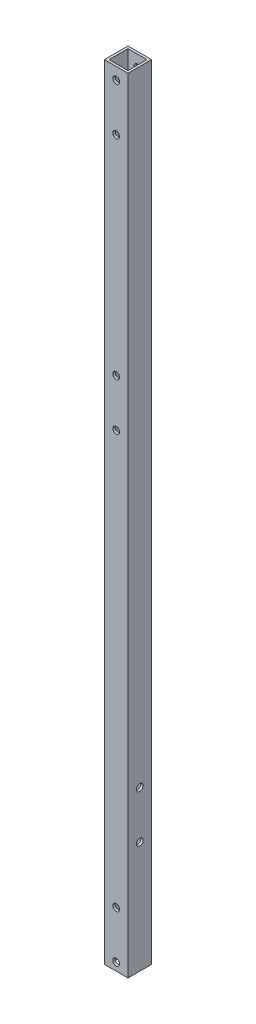
ISO-10303-21;
HEADER;
FILE_DESCRIPTION(('STEP AP214'),'2;1');
FILE_NAME('part.step','',(''),(''),'','','');
FILE_SCHEMA(('AUTOMOTIVE_DESIGN { 1 0 10303 214 1 1 1 1 }'));
ENDSEC;
DATA;
#1=APPLICATION_CONTEXT('core data for automotive mechanical design processes');
#2=APPLICATION_PROTOCOL_DEFINITION('international standard','automotive_design',2000,#1);
#3=PRODUCT_CONTEXT('',#1,'mechanical');
#4=PRODUCT('Part','Part','',(#3));
#5=PRODUCT_RELATED_PRODUCT_CATEGORY('part','',(#4));
#6=PRODUCT_DEFINITION_FORMATION('','',#4);
#7=PRODUCT_DEFINITION_CONTEXT('part definition',#1,'design');
#8=PRODUCT_DEFINITION('design','',#6,#7);
#9=PRODUCT_DEFINITION_SHAPE('','',#8);
#10=(LENGTH_UNIT() NAMED_UNIT(*) SI_UNIT(.MILLI.,.METRE.));
#11=(NAMED_UNIT(*) PLANE_ANGLE_UNIT() SI_UNIT($,.RADIAN.));
#12=(NAMED_UNIT(*) SI_UNIT($,.STERADIAN.) SOLID_ANGLE_UNIT());
#13=UNCERTAINTY_MEASURE_WITH_UNIT(LENGTH_MEASURE(1.E-05),#10,'distance_accuracy_value','');
#14=(GEOMETRIC_REPRESENTATION_CONTEXT(3) GLOBAL_UNCERTAINTY_ASSIGNED_CONTEXT((#13)) GLOBAL_UNIT_ASSIGNED_CONTEXT((#10,
#11,#12)) REPRESENTATION_CONTEXT('',''));
#15=CARTESIAN_POINT('',(0.,0.,0.));
#16=DIRECTION('',(0.,0.,1.));
#17=DIRECTION('',(1.,0.,0.));
#18=AXIS2_PLACEMENT_3D('',#15,#16,#17);
#19=CARTESIAN_POINT('',(0.,497.5,0.));
#20=DIRECTION('',(0.,1.,0.));
#21=DIRECTION('',(0.,0.,1.));
#22=AXIS2_PLACEMENT_3D('',#19,#20,#21);
#23=PLANE('',#22);
#24=DIRECTION('',(0.,0.,-1.));
#25=VECTOR('',#24,1.);
#26=CARTESIAN_POINT('',(7.49999999999999,497.5,-7.5));
#27=LINE('',#26,#25);
#28=CARTESIAN_POINT('',(7.5,497.5,7.5));
#29=VERTEX_POINT('',#28);
#30=CARTESIAN_POINT('',(7.49999999999999,497.5,-7.5));
#31=VERTEX_POINT('',#30);
#32=EDGE_CURVE('E164',#29,#31,#27,.T.);
#33=ORIENTED_EDGE('',*,*,#32,.T.);
#34=DIRECTION('',(-1.,0.,0.));
#35=VECTOR('',#34,1.);
#36=CARTESIAN_POINT('',(-7.50000000000001,497.5,-7.5));
#37=LINE('',#36,#35);
#38=CARTESIAN_POINT('',(-7.50000000000001,497.5,-7.5));
#39=VERTEX_POINT('',#38);
#40=EDGE_CURVE('E167',#31,#39,#37,.T.);
#41=ORIENTED_EDGE('',*,*,#40,.T.);
#42=DIRECTION('',(0.,0.,1.));
#43=VECTOR('',#42,1.);
#44=CARTESIAN_POINT('',(-7.50000000000001,497.5,-7.5));
#45=LINE('',#44,#43);
#46=CARTESIAN_POINT('',(-7.5,497.5,7.5));
#47=VERTEX_POINT('',#46);
#48=EDGE_CURVE('E170',#39,#47,#45,.T.);
#49=ORIENTED_EDGE('',*,*,#48,.T.);
#50=DIRECTION('',(1.,0.,0.));
#51=VECTOR('',#50,1.);
#52=CARTESIAN_POINT('',(-7.5,497.5,7.5));
#53=LINE('',#52,#51);
#54=EDGE_CURVE('E172',#47,#29,#53,.T.);
#55=ORIENTED_EDGE('',*,*,#54,.T.);
#56=EDGE_LOOP('',(#33,#41,#49,#55));
#57=FACE_BOUND('',#56,.T.);
#58=DIRECTION('',(-1.,0.,0.));
#59=VECTOR('',#58,1.);
#60=CARTESIAN_POINT('',(-7.50000000000001,497.5,-6.));
#61=LINE('',#60,#59);
#62=CARTESIAN_POINT('',(5.99999999999999,497.5,-6.));
#63=VERTEX_POINT('',#62);
#64=CARTESIAN_POINT('',(-6.00000000000001,497.5,-6.));
#65=VERTEX_POINT('',#64);
#66=EDGE_CURVE('E134',#63,#65,#61,.T.);
#67=ORIENTED_EDGE('',*,*,#66,.F.);
#68=DIRECTION('',(0.,0.,-1.));
#69=VECTOR('',#68,1.);
#70=CARTESIAN_POINT('',(5.99999999999999,497.5,-7.5));
#71=LINE('',#70,#69);
#72=CARTESIAN_POINT('',(6.,497.5,5.99999999999999));
#73=VERTEX_POINT('',#72);
#74=EDGE_CURVE('E126',#73,#63,#71,.T.);
#75=ORIENTED_EDGE('',*,*,#74,.F.);
#76=DIRECTION('',(1.,0.,0.));
#77=VECTOR('',#76,1.);
#78=CARTESIAN_POINT('',(-7.5,497.5,5.99999999999999));
#79=LINE('',#78,#77);
#80=CARTESIAN_POINT('',(-6.,497.5,5.99999999999999));
#81=VERTEX_POINT('',#80);
#82=EDGE_CURVE('E148',#81,#73,#79,.T.);
#83=ORIENTED_EDGE('',*,*,#82,.F.);
#84=DIRECTION('',(0.,0.,1.));
#85=VECTOR('',#84,1.);
#86=CARTESIAN_POINT('',(-6.00000000000001,497.5,-7.5));
#87=LINE('',#86,#85);
#88=EDGE_CURVE('E146',#65,#81,#87,.T.);
#89=ORIENTED_EDGE('',*,*,#88,.F.);
#90=EDGE_LOOP('',(#67,#75,#83,#89));
#91=FACE_BOUND('',#90,.T.);
#92=ADVANCED_FACE('F59',(#57,#91),#23,.T.);
#93=CARTESIAN_POINT('',(0.,0.,0.));
#94=DIRECTION('',(0.,1.,0.));
#95=DIRECTION('',(0.,0.,1.));
#96=AXIS2_PLACEMENT_3D('',#93,#94,#95);
#97=PLANE('',#96);
#98=DIRECTION('',(0.,0.,-1.));
#99=VECTOR('',#98,1.);
#100=CARTESIAN_POINT('',(7.49999999999999,0.,-7.5));
#101=LINE('',#100,#99);
#102=CARTESIAN_POINT('',(7.5,0.,7.5));
#103=VERTEX_POINT('',#102);
#104=CARTESIAN_POINT('',(7.49999999999999,0.,-7.5));
#105=VERTEX_POINT('',#104);
#106=EDGE_CURVE('E142',#103,#105,#101,.T.);
#107=ORIENTED_EDGE('',*,*,#106,.F.);
#108=DIRECTION('',(1.,0.,0.));
#109=VECTOR('',#108,1.);
#110=CARTESIAN_POINT('',(-7.5,0.,7.5));
#111=LINE('',#110,#109);
#112=CARTESIAN_POINT('',(-7.5,0.,7.5));
#113=VERTEX_POINT('',#112);
#114=EDGE_CURVE('E168',#113,#103,#111,.T.);
#115=ORIENTED_EDGE('',*,*,#114,.F.);
#116=DIRECTION('',(0.,0.,1.));
#117=VECTOR('',#116,1.);
#118=CARTESIAN_POINT('',(-7.50000000000001,0.,-7.5));
#119=LINE('',#118,#117);
#120=CARTESIAN_POINT('',(-7.50000000000001,0.,-7.5));
#121=VERTEX_POINT('',#120);
#122=EDGE_CURVE('E179',#121,#113,#119,.T.);
#123=ORIENTED_EDGE('',*,*,#122,.F.);
#124=DIRECTION('',(-1.,0.,0.));
#125=VECTOR('',#124,1.);
#126=CARTESIAN_POINT('',(-7.50000000000001,0.,-7.5));
#127=LINE('',#126,#125);
#128=EDGE_CURVE('E177',#105,#121,#127,.T.);
#129=ORIENTED_EDGE('',*,*,#128,.F.);
#130=EDGE_LOOP('',(#107,#115,#123,#129));
#131=FACE_BOUND('',#130,.T.);
#132=DIRECTION('',(0.,0.,-1.));
#133=VECTOR('',#132,1.);
#134=CARTESIAN_POINT('',(5.99999999999999,0.,-7.5));
#135=LINE('',#134,#133);
#136=CARTESIAN_POINT('',(6.,0.,5.99999999999999));
#137=VERTEX_POINT('',#136);
#138=CARTESIAN_POINT('',(5.99999999999999,0.,-6.));
#139=VERTEX_POINT('',#138);
#140=EDGE_CURVE('E84',#137,#139,#135,.T.);
#141=ORIENTED_EDGE('',*,*,#140,.T.);
#142=DIRECTION('',(-1.,0.,0.));
#143=VECTOR('',#142,1.);
#144=CARTESIAN_POINT('',(-7.50000000000001,0.,-6.));
#145=LINE('',#144,#143);
#146=CARTESIAN_POINT('',(-6.00000000000001,0.,-6.));
#147=VERTEX_POINT('',#146);
#148=EDGE_CURVE('E141',#139,#147,#145,.T.);
#149=ORIENTED_EDGE('',*,*,#148,.T.);
#150=DIRECTION('',(0.,0.,1.));
#151=VECTOR('',#150,1.);
#152=CARTESIAN_POINT('',(-6.00000000000001,0.,-7.5));
#153=LINE('',#152,#151);
#154=CARTESIAN_POINT('',(-6.,0.,5.99999999999999));
#155=VERTEX_POINT('',#154);
#156=EDGE_CURVE('E156',#147,#155,#153,.T.);
#157=ORIENTED_EDGE('',*,*,#156,.T.);
#158=DIRECTION('',(1.,0.,0.));
#159=VECTOR('',#158,1.);
#160=CARTESIAN_POINT('',(-7.5,0.,5.99999999999999));
#161=LINE('',#160,#159);
#162=EDGE_CURVE('E135',#155,#137,#161,.T.);
#163=ORIENTED_EDGE('',*,*,#162,.T.);
#164=EDGE_LOOP('',(#141,#149,#157,#163));
#165=FACE_BOUND('',#164,.T.);
#166=ADVANCED_FACE('F265',(#131,#165),#97,.F.);
#167=CARTESIAN_POINT('',(7.49999999999999,497.5,-7.5));
#168=DIRECTION('',(-1.,0.,0.));
#169=DIRECTION('',(0.,0.,1.));
#170=AXIS2_PLACEMENT_3D('',#167,#168,#169);
#171=PLANE('',#170);
#172=CARTESIAN_POINT('',(7.5,71.,0.));
#173=DIRECTION('',(1.,0.,0.));
#174=DIRECTION('',(0.,0.,-1.));
#175=AXIS2_PLACEMENT_3D('',#172,#173,#174);
#176=CIRCLE('',#175,2.15);
#177=CARTESIAN_POINT('',(7.5,71.,-2.15));
#178=VERTEX_POINT('',#177);
#179=EDGE_CURVE('E233',#178,#178,#176,.T.);
#180=ORIENTED_EDGE('',*,*,#179,.F.);
#181=EDGE_LOOP('',(#180));
#182=FACE_BOUND('',#181,.T.);
#183=CARTESIAN_POINT('',(7.5,101.,0.));
#184=DIRECTION('',(1.,0.,0.));
#185=DIRECTION('',(0.,0.,-1.));
#186=AXIS2_PLACEMENT_3D('',#183,#184,#185);
#187=CIRCLE('',#186,2.15);
#188=CARTESIAN_POINT('',(7.5,101.,-2.15));
#189=VERTEX_POINT('',#188);
#190=EDGE_CURVE('E230',#189,#189,#187,.T.);
#191=ORIENTED_EDGE('',*,*,#190,.F.);
#192=EDGE_LOOP('',(#191));
#193=FACE_BOUND('',#192,.T.);
#194=ORIENTED_EDGE('',*,*,#106,.T.);
#195=DIRECTION('',(0.,-1.,0.));
#196=VECTOR('',#195,1.);
#197=CARTESIAN_POINT('',(7.49999999999999,497.5,-7.5));
#198=LINE('',#197,#196);
#199=EDGE_CURVE('E12',#31,#105,#198,.T.);
#200=ORIENTED_EDGE('',*,*,#199,.F.);
#201=ORIENTED_EDGE('',*,*,#32,.F.);
#202=DIRECTION('',(0.,-1.,0.));
#203=VECTOR('',#202,1.);
#204=CARTESIAN_POINT('',(7.5,497.5,7.5));
#205=LINE('',#204,#203);
#206=EDGE_CURVE('E174',#29,#103,#205,.T.);
#207=ORIENTED_EDGE('',*,*,#206,.T.);
#208=EDGE_LOOP('',(#194,#200,#201,#207));
#209=FACE_BOUND('',#208,.T.);
#210=ADVANCED_FACE('F61',(#182,#193,#209),#171,.F.);
#211=CARTESIAN_POINT('',(-7.50000000000001,497.5,-7.5));
#212=DIRECTION('',(0.,0.,1.));
#213=DIRECTION('',(1.,0.,0.));
#214=AXIS2_PLACEMENT_3D('',#211,#212,#213);
#215=PLANE('',#214);
#216=CARTESIAN_POINT('',(0.,5.,-7.5));
#217=DIRECTION('',(0.,0.,1.));
#218=DIRECTION('',(1.,0.,0.));
#219=AXIS2_PLACEMENT_3D('',#216,#217,#218);
#220=CIRCLE('',#219,2.15);
#221=CARTESIAN_POINT('',(2.15,5.,-7.5));
#222=VERTEX_POINT('',#221);
#223=EDGE_CURVE('E373',#222,#222,#220,.T.);
#224=ORIENTED_EDGE('',*,*,#223,.T.);
#225=EDGE_LOOP('',(#224));
#226=FACE_BOUND('',#225,.T.);
#227=CARTESIAN_POINT('',(0.,297.5,-7.5));
#228=DIRECTION('',(0.,0.,1.));
#229=DIRECTION('',(1.,0.,0.));
#230=AXIS2_PLACEMENT_3D('',#227,#228,#229);
#231=CIRCLE('',#230,2.15000000000001);
#232=CARTESIAN_POINT('',(2.15000000000004,297.5,-7.5));
#233=VERTEX_POINT('',#232);
#234=EDGE_CURVE('E380',#233,#233,#231,.T.);
#235=ORIENTED_EDGE('',*,*,#234,.T.);
#236=EDGE_LOOP('',(#235));
#237=FACE_BOUND('',#236,.T.);
#238=CARTESIAN_POINT('',(0.,327.5,-7.5));
#239=DIRECTION('',(0.,0.,1.));
#240=DIRECTION('',(1.,0.,0.));
#241=AXIS2_PLACEMENT_3D('',#238,#239,#240);
#242=CIRCLE('',#241,2.15000000000001);
#243=CARTESIAN_POINT('',(2.15000000000004,327.5,-7.5));
#244=VERTEX_POINT('',#243);
#245=EDGE_CURVE('E386',#244,#244,#242,.T.);
#246=ORIENTED_EDGE('',*,*,#245,.T.);
#247=EDGE_LOOP('',(#246));
#248=FACE_BOUND('',#247,.T.);
#249=CARTESIAN_POINT('',(0.,490.,-7.5));
#250=DIRECTION('',(0.,0.,1.));
#251=DIRECTION('',(1.,0.,0.));
#252=AXIS2_PLACEMENT_3D('',#249,#250,#251);
#253=CIRCLE('',#252,2.15000000000001);
#254=CARTESIAN_POINT('',(2.15000000000002,490.,-7.5));
#255=VERTEX_POINT('',#254);
#256=EDGE_CURVE('E368',#255,#255,#253,.T.);
#257=ORIENTED_EDGE('',*,*,#256,.T.);
#258=EDGE_LOOP('',(#257));
#259=FACE_BOUND('',#258,.T.);
#260=CARTESIAN_POINT('',(0.,460.,-7.5));
#261=DIRECTION('',(0.,0.,1.));
#262=DIRECTION('',(1.,0.,0.));
#263=AXIS2_PLACEMENT_3D('',#260,#261,#262);
#264=CIRCLE('',#263,2.15000000000001);
#265=CARTESIAN_POINT('',(2.15000000000003,460.,-7.5));
#266=VERTEX_POINT('',#265);
#267=EDGE_CURVE('E362',#266,#266,#264,.T.);
#268=ORIENTED_EDGE('',*,*,#267,.T.);
#269=EDGE_LOOP('',(#268));
#270=FACE_BOUND('',#269,.T.);
#271=CARTESIAN_POINT('',(0.,35.,-7.5));
#272=DIRECTION('',(0.,0.,1.));
#273=DIRECTION('',(1.,0.,0.));
#274=AXIS2_PLACEMENT_3D('',#271,#272,#273);
#275=CIRCLE('',#274,2.15);
#276=CARTESIAN_POINT('',(2.15,35.,-7.5));
#277=VERTEX_POINT('',#276);
#278=EDGE_CURVE('E201',#277,#277,#275,.T.);
#279=ORIENTED_EDGE('',*,*,#278,.T.);
#280=EDGE_LOOP('',(#279));
#281=FACE_BOUND('',#280,.T.);
#282=ORIENTED_EDGE('',*,*,#128,.T.);
#283=DIRECTION('',(0.,-1.,0.));
#284=VECTOR('',#283,1.);
#285=CARTESIAN_POINT('',(-7.50000000000001,497.5,-7.5));
#286=LINE('',#285,#284);
#287=EDGE_CURVE('E68',#39,#121,#286,.T.);
#288=ORIENTED_EDGE('',*,*,#287,.F.);
#289=ORIENTED_EDGE('',*,*,#40,.F.);
#290=ORIENTED_EDGE('',*,*,#199,.T.);
#291=EDGE_LOOP('',(#282,#288,#289,#290));
#292=FACE_BOUND('',#291,.T.);
#293=ADVANCED_FACE('F264',(#226,#237,#248,#259,#270,#281,#292),#215,.F.);
#294=CARTESIAN_POINT('',(-7.50000000000001,497.5,-7.5));
#295=DIRECTION('',(1.,0.,0.));
#296=DIRECTION('',(0.,0.,-1.));
#297=AXIS2_PLACEMENT_3D('',#294,#295,#296);
#298=PLANE('',#297);
#299=CARTESIAN_POINT('',(-7.50000000000001,71.,0.));
#300=DIRECTION('',(1.,0.,0.));
#301=DIRECTION('',(0.,0.,-1.));
#302=AXIS2_PLACEMENT_3D('',#299,#300,#301);
#303=CIRCLE('',#302,2.15);
#304=CARTESIAN_POINT('',(-7.50000000000001,71.,-2.15));
#305=VERTEX_POINT('',#304);
#306=EDGE_CURVE('E193',#305,#305,#303,.T.);
#307=ORIENTED_EDGE('',*,*,#306,.T.);
#308=EDGE_LOOP('',(#307));
#309=FACE_BOUND('',#308,.T.);
#310=CARTESIAN_POINT('',(-7.50000000000001,101.,0.));
#311=DIRECTION('',(1.,0.,0.));
#312=DIRECTION('',(0.,0.,-1.));
#313=AXIS2_PLACEMENT_3D('',#310,#311,#312);
#314=CIRCLE('',#313,2.15);
#315=CARTESIAN_POINT('',(-7.50000000000001,101.,-2.15));
#316=VERTEX_POINT('',#315);
#317=EDGE_CURVE('E236',#316,#316,#314,.T.);
#318=ORIENTED_EDGE('',*,*,#317,.T.);
#319=EDGE_LOOP('',(#318));
#320=FACE_BOUND('',#319,.T.);
#321=ORIENTED_EDGE('',*,*,#122,.T.);
#322=DIRECTION('',(0.,-1.,0.));
#323=VECTOR('',#322,1.);
#324=CARTESIAN_POINT('',(-7.5,497.5,7.5));
#325=LINE('',#324,#323);
#326=EDGE_CURVE('E184',#47,#113,#325,.T.);
#327=ORIENTED_EDGE('',*,*,#326,.F.);
#328=ORIENTED_EDGE('',*,*,#48,.F.);
#329=ORIENTED_EDGE('',*,*,#287,.T.);
#330=EDGE_LOOP('',(#321,#327,#328,#329));
#331=FACE_BOUND('',#330,.T.);
#332=ADVANCED_FACE('F283',(#309,#320,#331),#298,.F.);
#333=CARTESIAN_POINT('',(-7.5,497.5,7.5));
#334=DIRECTION('',(0.,0.,-1.));
#335=DIRECTION('',(-1.,0.,0.));
#336=AXIS2_PLACEMENT_3D('',#333,#334,#335);
#337=PLANE('',#336);
#338=CARTESIAN_POINT('',(0.,5.,7.5));
#339=DIRECTION('',(0.,0.,1.));
#340=DIRECTION('',(1.,0.,0.));
#341=AXIS2_PLACEMENT_3D('',#338,#339,#340);
#342=CIRCLE('',#341,2.15);
#343=CARTESIAN_POINT('',(2.15,5.,7.5));
#344=VERTEX_POINT('',#343);
#345=EDGE_CURVE('E377',#344,#344,#342,.T.);
#346=ORIENTED_EDGE('',*,*,#345,.F.);
#347=EDGE_LOOP('',(#346));
#348=FACE_BOUND('',#347,.T.);
#349=CARTESIAN_POINT('',(0.,297.5,7.5));
#350=DIRECTION('',(0.,0.,1.));
#351=DIRECTION('',(1.,0.,0.));
#352=AXIS2_PLACEMENT_3D('',#349,#350,#351);
#353=CIRCLE('',#352,2.15000000000001);
#354=CARTESIAN_POINT('',(2.15000000000004,297.5,7.5));
#355=VERTEX_POINT('',#354);
#356=EDGE_CURVE('E383',#355,#355,#353,.T.);
#357=ORIENTED_EDGE('',*,*,#356,.F.);
#358=EDGE_LOOP('',(#357));
#359=FACE_BOUND('',#358,.T.);
#360=CARTESIAN_POINT('',(0.,327.5,7.5));
#361=DIRECTION('',(0.,0.,1.));
#362=DIRECTION('',(1.,0.,0.));
#363=AXIS2_PLACEMENT_3D('',#360,#361,#362);
#364=CIRCLE('',#363,2.15000000000001);
#365=CARTESIAN_POINT('',(2.15000000000004,327.5,7.5));
#366=VERTEX_POINT('',#365);
#367=EDGE_CURVE('E389',#366,#366,#364,.T.);
#368=ORIENTED_EDGE('',*,*,#367,.F.);
#369=EDGE_LOOP('',(#368));
#370=FACE_BOUND('',#369,.T.);
#371=CARTESIAN_POINT('',(0.,490.,7.5));
#372=DIRECTION('',(0.,0.,1.));
#373=DIRECTION('',(1.,0.,0.));
#374=AXIS2_PLACEMENT_3D('',#371,#372,#373);
#375=CIRCLE('',#374,2.15000000000001);
#376=CARTESIAN_POINT('',(2.15000000000002,490.,7.5));
#377=VERTEX_POINT('',#376);
#378=EDGE_CURVE('E364',#377,#377,#375,.T.);
#379=ORIENTED_EDGE('',*,*,#378,.F.);
#380=EDGE_LOOP('',(#379));
#381=FACE_BOUND('',#380,.T.);
#382=CARTESIAN_POINT('',(0.,460.,7.5));
#383=DIRECTION('',(0.,0.,1.));
#384=DIRECTION('',(1.,0.,0.));
#385=AXIS2_PLACEMENT_3D('',#382,#383,#384);
#386=CIRCLE('',#385,2.15000000000001);
#387=CARTESIAN_POINT('',(2.15000000000003,460.,7.5));
#388=VERTEX_POINT('',#387);
#389=EDGE_CURVE('E365',#388,#388,#386,.T.);
#390=ORIENTED_EDGE('',*,*,#389,.F.);
#391=EDGE_LOOP('',(#390));
#392=FACE_BOUND('',#391,.T.);
#393=CARTESIAN_POINT('',(0.,35.,7.5));
#394=DIRECTION('',(0.,0.,1.));
#395=DIRECTION('',(1.,0.,0.));
#396=AXIS2_PLACEMENT_3D('',#393,#394,#395);
#397=CIRCLE('',#396,2.15);
#398=CARTESIAN_POINT('',(2.15,35.,7.5));
#399=VERTEX_POINT('',#398);
#400=EDGE_CURVE('E376',#399,#399,#397,.T.);
#401=ORIENTED_EDGE('',*,*,#400,.F.);
#402=EDGE_LOOP('',(#401));
#403=FACE_BOUND('',#402,.T.);
#404=ORIENTED_EDGE('',*,*,#114,.T.);
#405=ORIENTED_EDGE('',*,*,#206,.F.);
#406=ORIENTED_EDGE('',*,*,#54,.F.);
#407=ORIENTED_EDGE('',*,*,#326,.T.);
#408=EDGE_LOOP('',(#404,#405,#406,#407));
#409=FACE_BOUND('',#408,.T.);
#410=ADVANCED_FACE('F250',(#348,#359,#370,#381,#392,#403,#409),#337,.F.);
#411=CARTESIAN_POINT('',(5.99999999999999,497.5,-7.5));
#412=DIRECTION('',(-1.,0.,0.));
#413=DIRECTION('',(0.,0.,1.));
#414=AXIS2_PLACEMENT_3D('',#411,#412,#413);
#415=PLANE('',#414);
#416=CARTESIAN_POINT('',(6.,71.,0.));
#417=DIRECTION('',(-1.,0.,0.));
#418=DIRECTION('',(0.,0.,1.));
#419=AXIS2_PLACEMENT_3D('',#416,#417,#418);
#420=CIRCLE('',#419,2.15);
#421=CARTESIAN_POINT('',(6.,71.,2.15));
#422=VERTEX_POINT('',#421);
#423=EDGE_CURVE('E154',#422,#422,#420,.T.);
#424=ORIENTED_EDGE('',*,*,#423,.F.);
#425=EDGE_LOOP('',(#424));
#426=FACE_BOUND('',#425,.T.);
#427=CARTESIAN_POINT('',(6.,101.,0.));
#428=DIRECTION('',(-1.,0.,0.));
#429=DIRECTION('',(0.,0.,1.));
#430=AXIS2_PLACEMENT_3D('',#427,#428,#429);
#431=CIRCLE('',#430,2.15);
#432=CARTESIAN_POINT('',(6.,101.,2.15));
#433=VERTEX_POINT('',#432);
#434=EDGE_CURVE('E192',#433,#433,#431,.T.);
#435=ORIENTED_EDGE('',*,*,#434,.F.);
#436=EDGE_LOOP('',(#435));
#437=FACE_BOUND('',#436,.T.);
#438=ORIENTED_EDGE('',*,*,#140,.F.);
#439=DIRECTION('',(0.,-1.,0.));
#440=VECTOR('',#439,1.);
#441=CARTESIAN_POINT('',(6.,497.5,5.99999999999999));
#442=LINE('',#441,#440);
#443=EDGE_CURVE('E130',#73,#137,#442,.T.);
#444=ORIENTED_EDGE('',*,*,#443,.F.);
#445=ORIENTED_EDGE('',*,*,#74,.T.);
#446=DIRECTION('',(0.,-1.,0.));
#447=VECTOR('',#446,1.);
#448=CARTESIAN_POINT('',(5.99999999999999,497.5,-6.));
#449=LINE('',#448,#447);
#450=EDGE_CURVE('E129',#63,#139,#449,.T.);
#451=ORIENTED_EDGE('',*,*,#450,.T.);
#452=EDGE_LOOP('',(#438,#444,#445,#451));
#453=FACE_BOUND('',#452,.T.);
#454=ADVANCED_FACE('F128',(#426,#437,#453),#415,.T.);
#455=CARTESIAN_POINT('',(-7.50000000000001,497.5,-6.));
#456=DIRECTION('',(0.,0.,1.));
#457=DIRECTION('',(1.,0.,0.));
#458=AXIS2_PLACEMENT_3D('',#455,#456,#457);
#459=PLANE('',#458);
#460=CARTESIAN_POINT('',(0.,5.,-6.));
#461=DIRECTION('',(0.,0.,1.));
#462=DIRECTION('',(1.,0.,0.));
#463=AXIS2_PLACEMENT_3D('',#460,#461,#462);
#464=CIRCLE('',#463,2.15);
#465=CARTESIAN_POINT('',(2.15,5.,-6.));
#466=VERTEX_POINT('',#465);
#467=EDGE_CURVE('E227',#466,#466,#464,.T.);
#468=ORIENTED_EDGE('',*,*,#467,.F.);
#469=EDGE_LOOP('',(#468));
#470=FACE_BOUND('',#469,.T.);
#471=CARTESIAN_POINT('',(0.,297.5,-6.));
#472=DIRECTION('',(0.,0.,1.));
#473=DIRECTION('',(1.,0.,0.));
#474=AXIS2_PLACEMENT_3D('',#471,#472,#473);
#475=CIRCLE('',#474,2.15000000000001);
#476=CARTESIAN_POINT('',(2.15000000000004,297.5,-6.));
#477=VERTEX_POINT('',#476);
#478=EDGE_CURVE('E215',#477,#477,#475,.T.);
#479=ORIENTED_EDGE('',*,*,#478,.F.);
#480=EDGE_LOOP('',(#479));
#481=FACE_BOUND('',#480,.T.);
#482=CARTESIAN_POINT('',(0.,327.5,-6.));
#483=DIRECTION('',(0.,0.,1.));
#484=DIRECTION('',(1.,0.,0.));
#485=AXIS2_PLACEMENT_3D('',#482,#483,#484);
#486=CIRCLE('',#485,2.15000000000001);
#487=CARTESIAN_POINT('',(2.15000000000004,327.5,-6.));
#488=VERTEX_POINT('',#487);
#489=EDGE_CURVE('E212',#488,#488,#486,.T.);
#490=ORIENTED_EDGE('',*,*,#489,.F.);
#491=EDGE_LOOP('',(#490));
#492=FACE_BOUND('',#491,.T.);
#493=CARTESIAN_POINT('',(0.,490.,-6.));
#494=DIRECTION('',(0.,0.,1.));
#495=DIRECTION('',(1.,0.,0.));
#496=AXIS2_PLACEMENT_3D('',#493,#494,#495);
#497=CIRCLE('',#496,2.15000000000001);
#498=CARTESIAN_POINT('',(2.15000000000002,490.,-6.));
#499=VERTEX_POINT('',#498);
#500=EDGE_CURVE('E209',#499,#499,#497,.T.);
#501=ORIENTED_EDGE('',*,*,#500,.F.);
#502=EDGE_LOOP('',(#501));
#503=FACE_BOUND('',#502,.T.);
#504=CARTESIAN_POINT('',(0.,460.,-6.));
#505=DIRECTION('',(0.,0.,1.));
#506=DIRECTION('',(1.,0.,0.));
#507=AXIS2_PLACEMENT_3D('',#504,#505,#506);
#508=CIRCLE('',#507,2.15000000000001);
#509=CARTESIAN_POINT('',(2.15000000000003,460.,-6.));
#510=VERTEX_POINT('',#509);
#511=EDGE_CURVE('E205',#510,#510,#508,.T.);
#512=ORIENTED_EDGE('',*,*,#511,.F.);
#513=EDGE_LOOP('',(#512));
#514=FACE_BOUND('',#513,.T.);
#515=CARTESIAN_POINT('',(0.,35.,-6.));
#516=DIRECTION('',(0.,0.,1.));
#517=DIRECTION('',(1.,0.,0.));
#518=AXIS2_PLACEMENT_3D('',#515,#516,#517);
#519=CIRCLE('',#518,2.15);
#520=CARTESIAN_POINT('',(2.15,35.,-6.));
#521=VERTEX_POINT('',#520);
#522=EDGE_CURVE('E200',#521,#521,#519,.T.);
#523=ORIENTED_EDGE('',*,*,#522,.F.);
#524=EDGE_LOOP('',(#523));
#525=FACE_BOUND('',#524,.T.);
#526=ORIENTED_EDGE('',*,*,#148,.F.);
#527=ORIENTED_EDGE('',*,*,#450,.F.);
#528=ORIENTED_EDGE('',*,*,#66,.T.);
#529=DIRECTION('',(0.,-1.,0.));
#530=VECTOR('',#529,1.);
#531=CARTESIAN_POINT('',(-6.00000000000001,497.5,-6.));
#532=LINE('',#531,#530);
#533=EDGE_CURVE('E143',#65,#147,#532,.T.);
#534=ORIENTED_EDGE('',*,*,#533,.T.);
#535=EDGE_LOOP('',(#526,#527,#528,#534));
#536=FACE_BOUND('',#535,.T.);
#537=ADVANCED_FACE('F138',(#470,#481,#492,#503,#514,#525,#536),#459,.T.);
#538=CARTESIAN_POINT('',(-6.00000000000001,497.5,-7.5));
#539=DIRECTION('',(1.,0.,0.));
#540=DIRECTION('',(0.,0.,-1.));
#541=AXIS2_PLACEMENT_3D('',#538,#539,#540);
#542=PLANE('',#541);
#543=CARTESIAN_POINT('',(-6.,71.,0.));
#544=DIRECTION('',(1.,0.,0.));
#545=DIRECTION('',(0.,0.,-1.));
#546=AXIS2_PLACEMENT_3D('',#543,#544,#545);
#547=CIRCLE('',#546,2.15);
#548=CARTESIAN_POINT('',(-6.,71.,-2.15));
#549=VERTEX_POINT('',#548);
#550=EDGE_CURVE('E194',#549,#549,#547,.T.);
#551=ORIENTED_EDGE('',*,*,#550,.F.);
#552=EDGE_LOOP('',(#551));
#553=FACE_BOUND('',#552,.T.);
#554=CARTESIAN_POINT('',(-6.,101.,0.));
#555=DIRECTION('',(1.,0.,0.));
#556=DIRECTION('',(0.,0.,-1.));
#557=AXIS2_PLACEMENT_3D('',#554,#555,#556);
#558=CIRCLE('',#557,2.15);
#559=CARTESIAN_POINT('',(-6.,101.,-2.15));
#560=VERTEX_POINT('',#559);
#561=EDGE_CURVE('E189',#560,#560,#558,.T.);
#562=ORIENTED_EDGE('',*,*,#561,.F.);
#563=EDGE_LOOP('',(#562));
#564=FACE_BOUND('',#563,.T.);
#565=ORIENTED_EDGE('',*,*,#156,.F.);
#566=ORIENTED_EDGE('',*,*,#533,.F.);
#567=ORIENTED_EDGE('',*,*,#88,.T.);
#568=DIRECTION('',(0.,-1.,0.));
#569=VECTOR('',#568,1.);
#570=CARTESIAN_POINT('',(-6.,497.5,5.99999999999999));
#571=LINE('',#570,#569);
#572=EDGE_CURVE('E76',#81,#155,#571,.T.);
#573=ORIENTED_EDGE('',*,*,#572,.T.);
#574=EDGE_LOOP('',(#565,#566,#567,#573));
#575=FACE_BOUND('',#574,.T.);
#576=ADVANCED_FACE('F304',(#553,#564,#575),#542,.T.);
#577=CARTESIAN_POINT('',(-7.5,497.5,5.99999999999999));
#578=DIRECTION('',(0.,0.,-1.));
#579=DIRECTION('',(-1.,0.,0.));
#580=AXIS2_PLACEMENT_3D('',#577,#578,#579);
#581=PLANE('',#580);
#582=CARTESIAN_POINT('',(0.,5.,5.99999999999999));
#583=DIRECTION('',(0.,0.,-1.));
#584=DIRECTION('',(-1.,0.,0.));
#585=AXIS2_PLACEMENT_3D('',#582,#583,#584);
#586=CIRCLE('',#585,2.15);
#587=CARTESIAN_POINT('',(-2.15,5.,5.99999999999999));
#588=VERTEX_POINT('',#587);
#589=EDGE_CURVE('E63',#588,#588,#586,.T.);
#590=ORIENTED_EDGE('',*,*,#589,.F.);
#591=EDGE_LOOP('',(#590));
#592=FACE_BOUND('',#591,.T.);
#593=CARTESIAN_POINT('',(0.,297.5,5.99999999999999));
#594=DIRECTION('',(0.,0.,-1.));
#595=DIRECTION('',(-1.,0.,0.));
#596=AXIS2_PLACEMENT_3D('',#593,#594,#595);
#597=CIRCLE('',#596,2.15000000000001);
#598=CARTESIAN_POINT('',(-2.14999999999998,297.5,5.99999999999999));
#599=VERTEX_POINT('',#598);
#600=EDGE_CURVE('E213',#599,#599,#597,.T.);
#601=ORIENTED_EDGE('',*,*,#600,.F.);
#602=EDGE_LOOP('',(#601));
#603=FACE_BOUND('',#602,.T.);
#604=CARTESIAN_POINT('',(0.,327.5,5.99999999999999));
#605=DIRECTION('',(0.,0.,-1.));
#606=DIRECTION('',(-1.,0.,0.));
#607=AXIS2_PLACEMENT_3D('',#604,#605,#606);
#608=CIRCLE('',#607,2.15000000000001);
#609=CARTESIAN_POINT('',(-2.14999999999999,327.5,5.99999999999999));
#610=VERTEX_POINT('',#609);
#611=EDGE_CURVE('E210',#610,#610,#608,.T.);
#612=ORIENTED_EDGE('',*,*,#611,.F.);
#613=EDGE_LOOP('',(#612));
#614=FACE_BOUND('',#613,.T.);
#615=CARTESIAN_POINT('',(0.,490.,5.99999999999999));
#616=DIRECTION('',(0.,0.,-1.));
#617=DIRECTION('',(-1.,0.,0.));
#618=AXIS2_PLACEMENT_3D('',#615,#616,#617);
#619=CIRCLE('',#618,2.15000000000001);
#620=CARTESIAN_POINT('',(-2.15,490.,5.99999999999999));
#621=VERTEX_POINT('',#620);
#622=EDGE_CURVE('E206',#621,#621,#619,.T.);
#623=ORIENTED_EDGE('',*,*,#622,.F.);
#624=EDGE_LOOP('',(#623));
#625=FACE_BOUND('',#624,.T.);
#626=CARTESIAN_POINT('',(0.,460.,5.99999999999999));
#627=DIRECTION('',(0.,0.,-1.));
#628=DIRECTION('',(-1.,0.,0.));
#629=AXIS2_PLACEMENT_3D('',#626,#627,#628);
#630=CIRCLE('',#629,2.15000000000001);
#631=CARTESIAN_POINT('',(-2.15,460.,5.99999999999999));
#632=VERTEX_POINT('',#631);
#633=EDGE_CURVE('E202',#632,#632,#630,.T.);
#634=ORIENTED_EDGE('',*,*,#633,.F.);
#635=EDGE_LOOP('',(#634));
#636=FACE_BOUND('',#635,.T.);
#637=CARTESIAN_POINT('',(0.,35.,5.99999999999999));
#638=DIRECTION('',(0.,0.,-1.));
#639=DIRECTION('',(-1.,0.,0.));
#640=AXIS2_PLACEMENT_3D('',#637,#638,#639);
#641=CIRCLE('',#640,2.15);
#642=CARTESIAN_POINT('',(-2.15,35.,5.99999999999999));
#643=VERTEX_POINT('',#642);
#644=EDGE_CURVE('E197',#643,#643,#641,.T.);
#645=ORIENTED_EDGE('',*,*,#644,.F.);
#646=EDGE_LOOP('',(#645));
#647=FACE_BOUND('',#646,.T.);
#648=ORIENTED_EDGE('',*,*,#162,.F.);
#649=ORIENTED_EDGE('',*,*,#572,.F.);
#650=ORIENTED_EDGE('',*,*,#82,.T.);
#651=ORIENTED_EDGE('',*,*,#443,.T.);
#652=EDGE_LOOP('',(#648,#649,#650,#651));
#653=FACE_BOUND('',#652,.T.);
#654=ADVANCED_FACE('F308',(#592,#603,#614,#625,#636,#647,#653),#581,.T.);
#655=CARTESIAN_POINT('',(-7.50000000000001,101.,0.));
#656=DIRECTION('',(1.,0.,0.));
#657=DIRECTION('',(0.,0.,-1.));
#658=AXIS2_PLACEMENT_3D('',#655,#656,#657);
#659=CYLINDRICAL_SURFACE('',#658,2.15);
#660=ORIENTED_EDGE('',*,*,#561,.T.);
#661=EDGE_LOOP('',(#660));
#662=FACE_BOUND('',#661,.T.);
#663=ORIENTED_EDGE('',*,*,#317,.F.);
#664=EDGE_LOOP('',(#663));
#665=FACE_BOUND('',#664,.T.);
#666=ADVANCED_FACE('F259',(#662,#665),#659,.F.);
#667=CARTESIAN_POINT('',(-7.50000000000001,71.,0.));
#668=DIRECTION('',(1.,0.,0.));
#669=DIRECTION('',(0.,0.,-1.));
#670=AXIS2_PLACEMENT_3D('',#667,#668,#669);
#671=CYLINDRICAL_SURFACE('',#670,2.15);
#672=ORIENTED_EDGE('',*,*,#550,.T.);
#673=EDGE_LOOP('',(#672));
#674=FACE_BOUND('',#673,.T.);
#675=ORIENTED_EDGE('',*,*,#306,.F.);
#676=EDGE_LOOP('',(#675));
#677=FACE_BOUND('',#676,.T.);
#678=ADVANCED_FACE('F257',(#674,#677),#671,.F.);
#679=ORIENTED_EDGE('',*,*,#434,.T.);
#680=EDGE_LOOP('',(#679));
#681=FACE_BOUND('',#680,.T.);
#682=ORIENTED_EDGE('',*,*,#190,.T.);
#683=EDGE_LOOP('',(#682));
#684=FACE_BOUND('',#683,.T.);
#685=ADVANCED_FACE('F254',(#681,#684),#659,.F.);
#686=ORIENTED_EDGE('',*,*,#423,.T.);
#687=EDGE_LOOP('',(#686));
#688=FACE_BOUND('',#687,.T.);
#689=ORIENTED_EDGE('',*,*,#179,.T.);
#690=EDGE_LOOP('',(#689));
#691=FACE_BOUND('',#690,.T.);
#692=ADVANCED_FACE('F245',(#688,#691),#671,.F.);
#693=CARTESIAN_POINT('',(0.,35.,-7.5));
#694=DIRECTION('',(0.,0.,1.));
#695=DIRECTION('',(1.,0.,0.));
#696=AXIS2_PLACEMENT_3D('',#693,#694,#695);
#697=CYLINDRICAL_SURFACE('',#696,2.15);
#698=ORIENTED_EDGE('',*,*,#644,.T.);
#699=EDGE_LOOP('',(#698));
#700=FACE_BOUND('',#699,.T.);
#701=ORIENTED_EDGE('',*,*,#400,.T.);
#702=EDGE_LOOP('',(#701));
#703=FACE_BOUND('',#702,.T.);
#704=ADVANCED_FACE('F318',(#700,#703),#697,.F.);
#705=CARTESIAN_POINT('',(0.,460.,-7.5));
#706=DIRECTION('',(0.,0.,1.));
#707=DIRECTION('',(1.,0.,0.));
#708=AXIS2_PLACEMENT_3D('',#705,#706,#707);
#709=CYLINDRICAL_SURFACE('',#708,2.15000000000001);
#710=ORIENTED_EDGE('',*,*,#633,.T.);
#711=EDGE_LOOP('',(#710));
#712=FACE_BOUND('',#711,.T.);
#713=ORIENTED_EDGE('',*,*,#389,.T.);
#714=EDGE_LOOP('',(#713));
#715=FACE_BOUND('',#714,.T.);
#716=ADVANCED_FACE('F321',(#712,#715),#709,.F.);
#717=CARTESIAN_POINT('',(0.,490.,-7.5));
#718=DIRECTION('',(0.,0.,1.));
#719=DIRECTION('',(1.,0.,0.));
#720=AXIS2_PLACEMENT_3D('',#717,#718,#719);
#721=CYLINDRICAL_SURFACE('',#720,2.15000000000001);
#722=ORIENTED_EDGE('',*,*,#622,.T.);
#723=EDGE_LOOP('',(#722));
#724=FACE_BOUND('',#723,.T.);
#725=ORIENTED_EDGE('',*,*,#378,.T.);
#726=EDGE_LOOP('',(#725));
#727=FACE_BOUND('',#726,.T.);
#728=ADVANCED_FACE('F324',(#724,#727),#721,.F.);
#729=CARTESIAN_POINT('',(0.,327.5,-7.5));
#730=DIRECTION('',(0.,0.,1.));
#731=DIRECTION('',(1.,0.,0.));
#732=AXIS2_PLACEMENT_3D('',#729,#730,#731);
#733=CYLINDRICAL_SURFACE('',#732,2.15000000000001);
#734=ORIENTED_EDGE('',*,*,#611,.T.);
#735=EDGE_LOOP('',(#734));
#736=FACE_BOUND('',#735,.T.);
#737=ORIENTED_EDGE('',*,*,#367,.T.);
#738=EDGE_LOOP('',(#737));
#739=FACE_BOUND('',#738,.T.);
#740=ADVANCED_FACE('F327',(#736,#739),#733,.F.);
#741=CARTESIAN_POINT('',(0.,297.5,-7.5));
#742=DIRECTION('',(0.,0.,1.));
#743=DIRECTION('',(1.,0.,0.));
#744=AXIS2_PLACEMENT_3D('',#741,#742,#743);
#745=CYLINDRICAL_SURFACE('',#744,2.15000000000001);
#746=ORIENTED_EDGE('',*,*,#600,.T.);
#747=EDGE_LOOP('',(#746));
#748=FACE_BOUND('',#747,.T.);
#749=ORIENTED_EDGE('',*,*,#356,.T.);
#750=EDGE_LOOP('',(#749));
#751=FACE_BOUND('',#750,.T.);
#752=ADVANCED_FACE('F332',(#748,#751),#745,.F.);
#753=CARTESIAN_POINT('',(0.,5.,-7.5));
#754=DIRECTION('',(0.,0.,1.));
#755=DIRECTION('',(1.,0.,0.));
#756=AXIS2_PLACEMENT_3D('',#753,#754,#755);
#757=CYLINDRICAL_SURFACE('',#756,2.15);
#758=ORIENTED_EDGE('',*,*,#589,.T.);
#759=EDGE_LOOP('',(#758));
#760=FACE_BOUND('',#759,.T.);
#761=ORIENTED_EDGE('',*,*,#345,.T.);
#762=EDGE_LOOP('',(#761));
#763=FACE_BOUND('',#762,.T.);
#764=ADVANCED_FACE('F337',(#760,#763),#757,.F.);
#765=ORIENTED_EDGE('',*,*,#522,.T.);
#766=EDGE_LOOP('',(#765));
#767=FACE_BOUND('',#766,.T.);
#768=ORIENTED_EDGE('',*,*,#278,.F.);
#769=EDGE_LOOP('',(#768));
#770=FACE_BOUND('',#769,.T.);
#771=ADVANCED_FACE('F323',(#767,#770),#697,.F.);
#772=ORIENTED_EDGE('',*,*,#511,.T.);
#773=EDGE_LOOP('',(#772));
#774=FACE_BOUND('',#773,.T.);
#775=ORIENTED_EDGE('',*,*,#267,.F.);
#776=EDGE_LOOP('',(#775));
#777=FACE_BOUND('',#776,.T.);
#778=ADVANCED_FACE('F345',(#774,#777),#709,.F.);
#779=ORIENTED_EDGE('',*,*,#500,.T.);
#780=EDGE_LOOP('',(#779));
#781=FACE_BOUND('',#780,.T.);
#782=ORIENTED_EDGE('',*,*,#256,.F.);
#783=EDGE_LOOP('',(#782));
#784=FACE_BOUND('',#783,.T.);
#785=ADVANCED_FACE('F329',(#781,#784),#721,.F.);
#786=ORIENTED_EDGE('',*,*,#489,.T.);
#787=EDGE_LOOP('',(#786));
#788=FACE_BOUND('',#787,.T.);
#789=ORIENTED_EDGE('',*,*,#245,.F.);
#790=EDGE_LOOP('',(#789));
#791=FACE_BOUND('',#790,.T.);
#792=ADVANCED_FACE('F334',(#788,#791),#733,.F.);
#793=ORIENTED_EDGE('',*,*,#478,.T.);
#794=EDGE_LOOP('',(#793));
#795=FACE_BOUND('',#794,.T.);
#796=ORIENTED_EDGE('',*,*,#234,.F.);
#797=EDGE_LOOP('',(#796));
#798=FACE_BOUND('',#797,.T.);
#799=ADVANCED_FACE('F338',(#795,#798),#745,.F.);
#800=ORIENTED_EDGE('',*,*,#467,.T.);
#801=EDGE_LOOP('',(#800));
#802=FACE_BOUND('',#801,.T.);
#803=ORIENTED_EDGE('',*,*,#223,.F.);
#804=EDGE_LOOP('',(#803));
#805=FACE_BOUND('',#804,.T.);
#806=ADVANCED_FACE('F342',(#802,#805),#757,.F.);
#807=CLOSED_SHELL('',(#92,#166,#210,#293,#332,#410,#454,#537,#576,#654,#666,#678,#685,#692,#704,
#716,#728,#740,#752,#764,#771,#778,#785,#792,#799,#806));
#808=MANIFOLD_SOLID_BREP('B2',#807);
#809=ADVANCED_BREP_SHAPE_REPRESENTATION('',(#18,#808),#14);
#810=SHAPE_DEFINITION_REPRESENTATION(#9,#809);
ENDSEC;
END-ISO-10303-21;
